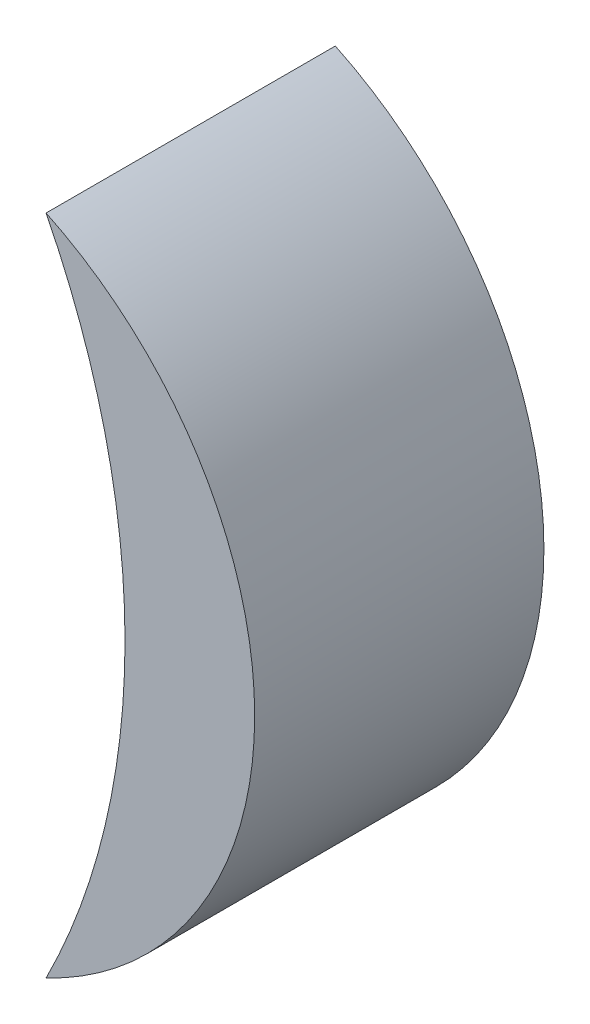
ISO-10303-21;
HEADER;
FILE_DESCRIPTION(('STEP AP214'),'2;1');
FILE_NAME('part.step','',(''),(''),'','','');
FILE_SCHEMA(('AUTOMOTIVE_DESIGN { 1 0 10303 214 1 1 1 1 }'));
ENDSEC;
DATA;
#1=APPLICATION_CONTEXT('core data for automotive mechanical design processes');
#2=APPLICATION_PROTOCOL_DEFINITION('international standard','automotive_design',2000,#1);
#3=PRODUCT_CONTEXT('',#1,'mechanical');
#4=PRODUCT('Part','Part','',(#3));
#5=PRODUCT_RELATED_PRODUCT_CATEGORY('part','',(#4));
#6=PRODUCT_DEFINITION_FORMATION('','',#4);
#7=PRODUCT_DEFINITION_CONTEXT('part definition',#1,'design');
#8=PRODUCT_DEFINITION('design','',#6,#7);
#9=PRODUCT_DEFINITION_SHAPE('','',#8);
#10=(LENGTH_UNIT() NAMED_UNIT(*) SI_UNIT(.MILLI.,.METRE.));
#11=(NAMED_UNIT(*) PLANE_ANGLE_UNIT() SI_UNIT($,.RADIAN.));
#12=(NAMED_UNIT(*) SI_UNIT($,.STERADIAN.) SOLID_ANGLE_UNIT());
#13=UNCERTAINTY_MEASURE_WITH_UNIT(LENGTH_MEASURE(1.E-05),#10,'distance_accuracy_value','');
#14=(GEOMETRIC_REPRESENTATION_CONTEXT(3) GLOBAL_UNCERTAINTY_ASSIGNED_CONTEXT((#13)) GLOBAL_UNIT_ASSIGNED_CONTEXT((#10,
#11,#12)) REPRESENTATION_CONTEXT('',''));
#15=CARTESIAN_POINT('',(0.,0.,0.));
#16=DIRECTION('',(0.,0.,1.));
#17=DIRECTION('',(1.,0.,0.));
#18=AXIS2_PLACEMENT_3D('',#15,#16,#17);
#19=CARTESIAN_POINT('',(90.51365946,110.363,0.));
#20=DIRECTION('',(0.,0.,-1.));
#21=DIRECTION('',(1.11896493820486E-13,-1.,0.));
#22=AXIS2_PLACEMENT_3D('',#19,#20,#21);
#23=CYLINDRICAL_SURFACE('',#22,0.25400000000001);
#24=CARTESIAN_POINT('',(90.51365946,110.363,0.1999996));
#25=DIRECTION('',(0.,0.,1.));
#26=DIRECTION('',(1.11896493820486E-13,-1.,0.));
#27=AXIS2_PLACEMENT_3D('',#24,#25,#26);
#28=CIRCLE('',#27,0.25400000000001);
#29=CARTESIAN_POINT('',(90.6234282636181,110.133943653761,0.1999996));
#30=VERTEX_POINT('',#29);
#31=CARTESIAN_POINT('',(90.6234282636181,110.592056346239,0.1999996));
#32=VERTEX_POINT('',#31);
#33=EDGE_CURVE('E11',#30,#32,#28,.T.);
#34=ORIENTED_EDGE('',*,*,#33,.F.);
#35=DIRECTION('',(0.,0.,1.));
#36=VECTOR('',#35,1.);
#37=CARTESIAN_POINT('',(90.6234282636181,110.133943653761,0.));
#38=LINE('',#37,#36);
#39=CARTESIAN_POINT('',(90.6234282636181,110.133943653761,0.));
#40=VERTEX_POINT('',#39);
#41=EDGE_CURVE('E24',#40,#30,#38,.T.);
#42=ORIENTED_EDGE('',*,*,#41,.F.);
#43=CARTESIAN_POINT('',(90.51365946,110.363,0.));
#44=DIRECTION('',(0.,0.,1.));
#45=DIRECTION('',(1.11896493820486E-13,-1.,0.));
#46=AXIS2_PLACEMENT_3D('',#43,#44,#45);
#47=CIRCLE('',#46,0.25400000000001);
#48=CARTESIAN_POINT('',(90.6234282636181,110.592056346239,0.));
#49=VERTEX_POINT('',#48);
#50=EDGE_CURVE('E66',#40,#49,#47,.T.);
#51=ORIENTED_EDGE('',*,*,#50,.T.);
#52=DIRECTION('',(0.,0.,1.));
#53=VECTOR('',#52,1.);
#54=CARTESIAN_POINT('',(90.6234282636181,110.592056346239,0.));
#55=LINE('',#54,#53);
#56=EDGE_CURVE('E37',#49,#32,#55,.T.);
#57=ORIENTED_EDGE('',*,*,#56,.T.);
#58=EDGE_LOOP('',(#34,#42,#51,#57));
#59=FACE_BOUND('',#58,.T.);
#60=ADVANCED_FACE('F17',(#59),#23,.T.);
#61=CARTESIAN_POINT('',(90.17,110.363,0.));
#62=DIRECTION('',(0.,0.,-1.));
#63=DIRECTION('',(1.,0.,0.));
#64=AXIS2_PLACEMENT_3D('',#61,#62,#63);
#65=CYLINDRICAL_SURFACE('',#64,0.508);
#66=DIRECTION('',(0.,0.,1.));
#67=VECTOR('',#66,1.);
#68=CARTESIAN_POINT('',(90.678,110.363,0.));
#69=LINE('',#68,#67);
#70=CARTESIAN_POINT('',(90.678,110.363,0.));
#71=VERTEX_POINT('',#70);
#72=CARTESIAN_POINT('',(90.678,110.363,0.1999996));
#73=VERTEX_POINT('',#72);
#74=EDGE_CURVE('E47',#71,#73,#69,.T.);
#75=ORIENTED_EDGE('',*,*,#74,.T.);
#76=CARTESIAN_POINT('',(90.17,110.363,0.1999996));
#77=DIRECTION('',(0.,0.,1.));
#78=DIRECTION('',(1.,0.,0.));
#79=AXIS2_PLACEMENT_3D('',#76,#77,#78);
#80=CIRCLE('',#79,0.508);
#81=EDGE_CURVE('E57',#73,#32,#80,.T.);
#82=ORIENTED_EDGE('',*,*,#81,.T.);
#83=ORIENTED_EDGE('',*,*,#56,.F.);
#84=CARTESIAN_POINT('',(90.17,110.363,0.));
#85=DIRECTION('',(0.,0.,1.));
#86=DIRECTION('',(1.,0.,0.));
#87=AXIS2_PLACEMENT_3D('',#84,#85,#86);
#88=CIRCLE('',#87,0.508);
#89=EDGE_CURVE('E60',#71,#49,#88,.T.);
#90=ORIENTED_EDGE('',*,*,#89,.F.);
#91=EDGE_LOOP('',(#75,#82,#83,#90));
#92=FACE_BOUND('',#91,.T.);
#93=ADVANCED_FACE('F61',(#92),#65,.F.);
#94=CARTESIAN_POINT('',(90.17,110.363,0.));
#95=DIRECTION('',(0.,0.,-1.));
#96=DIRECTION('',(1.,0.,0.));
#97=AXIS2_PLACEMENT_3D('',#94,#95,#96);
#98=CYLINDRICAL_SURFACE('',#97,0.508);
#99=ORIENTED_EDGE('',*,*,#41,.T.);
#100=CARTESIAN_POINT('',(90.17,110.363,0.1999996));
#101=DIRECTION('',(0.,0.,1.));
#102=DIRECTION('',(1.,0.,0.));
#103=AXIS2_PLACEMENT_3D('',#100,#101,#102);
#104=CIRCLE('',#103,0.508);
#105=EDGE_CURVE('E53',#30,#73,#104,.T.);
#106=ORIENTED_EDGE('',*,*,#105,.T.);
#107=ORIENTED_EDGE('',*,*,#74,.F.);
#108=EDGE_CURVE('E51',#40,#71,#88,.T.);
#109=ORIENTED_EDGE('',*,*,#108,.F.);
#110=EDGE_LOOP('',(#99,#106,#107,#109));
#111=FACE_BOUND('',#110,.T.);
#112=ADVANCED_FACE('F49',(#111),#98,.F.);
#113=CARTESIAN_POINT('',(90.17,110.109,0.));
#114=DIRECTION('',(0.,0.,-1.));
#115=DIRECTION('',(-1.,0.,0.));
#116=AXIS2_PLACEMENT_3D('',#113,#114,#115);
#117=PLANE('',#116);
#118=ORIENTED_EDGE('',*,*,#50,.F.);
#119=ORIENTED_EDGE('',*,*,#108,.T.);
#120=ORIENTED_EDGE('',*,*,#89,.T.);
#121=EDGE_LOOP('',(#118,#119,#120));
#122=FACE_BOUND('',#121,.T.);
#123=ADVANCED_FACE('F65',(#122),#117,.T.);
#124=CARTESIAN_POINT('',(90.17,110.109,0.1999996));
#125=DIRECTION('',(0.,0.,-1.));
#126=DIRECTION('',(-1.,0.,0.));
#127=AXIS2_PLACEMENT_3D('',#124,#125,#126);
#128=PLANE('',#127);
#129=ORIENTED_EDGE('',*,*,#105,.F.);
#130=ORIENTED_EDGE('',*,*,#33,.T.);
#131=ORIENTED_EDGE('',*,*,#81,.F.);
#132=EDGE_LOOP('',(#129,#130,#131));
#133=FACE_BOUND('',#132,.T.);
#134=ADVANCED_FACE('F72',(#133),#128,.F.);
#135=CLOSED_SHELL('',(#60,#93,#112,#123,#134));
#136=MANIFOLD_SOLID_BREP('B1',#135);
#137=ADVANCED_BREP_SHAPE_REPRESENTATION('',(#18,#136),#14);
#138=SHAPE_DEFINITION_REPRESENTATION(#9,#137);
ENDSEC;
END-ISO-10303-21;
